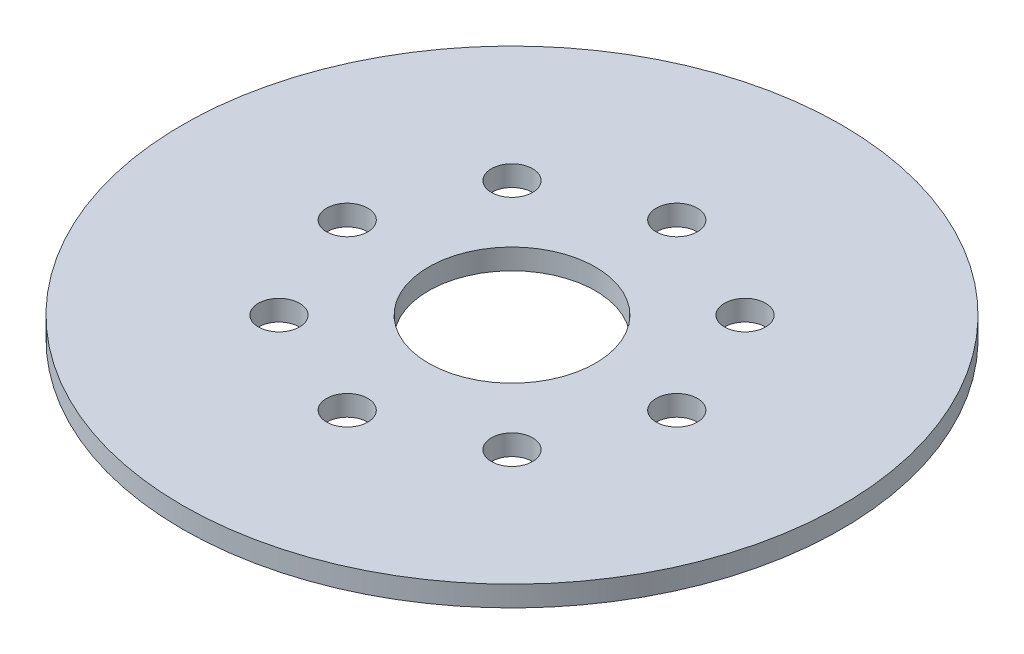
ISO-10303-21;
HEADER;
FILE_DESCRIPTION(('STEP AP214'),'2;1');
FILE_NAME('part.step','',(''),(''),'','','');
FILE_SCHEMA(('AUTOMOTIVE_DESIGN { 1 0 10303 214 1 1 1 1 }'));
ENDSEC;
DATA;
#1=APPLICATION_CONTEXT('core data for automotive mechanical design processes');
#2=APPLICATION_PROTOCOL_DEFINITION('international standard','automotive_design',2000,#1);
#3=PRODUCT_CONTEXT('',#1,'mechanical');
#4=PRODUCT('Part','Part','',(#3));
#5=PRODUCT_RELATED_PRODUCT_CATEGORY('part','',(#4));
#6=PRODUCT_DEFINITION_FORMATION('','',#4);
#7=PRODUCT_DEFINITION_CONTEXT('part definition',#1,'design');
#8=PRODUCT_DEFINITION('design','',#6,#7);
#9=PRODUCT_DEFINITION_SHAPE('','',#8);
#10=(LENGTH_UNIT() NAMED_UNIT(*) SI_UNIT(.MILLI.,.METRE.));
#11=(NAMED_UNIT(*) PLANE_ANGLE_UNIT() SI_UNIT($,.RADIAN.));
#12=(NAMED_UNIT(*) SI_UNIT($,.STERADIAN.) SOLID_ANGLE_UNIT());
#13=UNCERTAINTY_MEASURE_WITH_UNIT(LENGTH_MEASURE(1.E-05),#10,'distance_accuracy_value','');
#14=(GEOMETRIC_REPRESENTATION_CONTEXT(3) GLOBAL_UNCERTAINTY_ASSIGNED_CONTEXT((#13)) GLOBAL_UNIT_ASSIGNED_CONTEXT((#10,
#11,#12)) REPRESENTATION_CONTEXT('',''));
#15=CARTESIAN_POINT('',(0.,0.,0.));
#16=DIRECTION('',(0.,0.,1.));
#17=DIRECTION('',(1.,0.,0.));
#18=AXIS2_PLACEMENT_3D('',#15,#16,#17);
#19=CARTESIAN_POINT('',(0.,1.,0.));
#20=DIRECTION('',(0.,1.,0.));
#21=DIRECTION('',(0.,0.,1.));
#22=AXIS2_PLACEMENT_3D('',#19,#20,#21);
#23=PLANE('',#22);
#24=CARTESIAN_POINT('',(-8.,1.,0.));
#25=DIRECTION('',(0.,1.,0.));
#26=DIRECTION('',(0.,0.,1.));
#27=AXIS2_PLACEMENT_3D('',#24,#25,#26);
#28=CIRCLE('',#27,1.);
#29=CARTESIAN_POINT('',(-8.,1.,1.));
#30=VERTEX_POINT('',#29);
#31=EDGE_CURVE('E85',#30,#30,#28,.T.);
#32=ORIENTED_EDGE('',*,*,#31,.F.);
#33=EDGE_LOOP('',(#32));
#34=FACE_BOUND('',#33,.T.);
#35=CARTESIAN_POINT('',(0.,1.,8.));
#36=DIRECTION('',(0.,1.,0.));
#37=DIRECTION('',(0.,0.,1.));
#38=AXIS2_PLACEMENT_3D('',#35,#36,#37);
#39=CIRCLE('',#38,1.);
#40=CARTESIAN_POINT('',(0.,1.,9.));
#41=VERTEX_POINT('',#40);
#42=EDGE_CURVE('E73',#41,#41,#39,.T.);
#43=ORIENTED_EDGE('',*,*,#42,.F.);
#44=EDGE_LOOP('',(#43));
#45=FACE_BOUND('',#44,.T.);
#46=CARTESIAN_POINT('',(8.,1.,0.));
#47=DIRECTION('',(0.,1.,0.));
#48=DIRECTION('',(0.,0.,1.));
#49=AXIS2_PLACEMENT_3D('',#46,#47,#48);
#50=CIRCLE('',#49,1.);
#51=CARTESIAN_POINT('',(8.,1.,1.));
#52=VERTEX_POINT('',#51);
#53=EDGE_CURVE('E61',#52,#52,#50,.T.);
#54=ORIENTED_EDGE('',*,*,#53,.F.);
#55=EDGE_LOOP('',(#54));
#56=FACE_BOUND('',#55,.T.);
#57=CARTESIAN_POINT('',(0.,1.,-8.));
#58=DIRECTION('',(0.,1.,0.));
#59=DIRECTION('',(0.,0.,1.));
#60=AXIS2_PLACEMENT_3D('',#57,#58,#59);
#61=CIRCLE('',#60,1.);
#62=CARTESIAN_POINT('',(0.,1.,-7.));
#63=VERTEX_POINT('',#62);
#64=EDGE_CURVE('E49',#63,#63,#61,.T.);
#65=ORIENTED_EDGE('',*,*,#64,.F.);
#66=EDGE_LOOP('',(#65));
#67=FACE_BOUND('',#66,.T.);
#68=CARTESIAN_POINT('',(0.,1.,0.));
#69=DIRECTION('',(0.,1.,0.));
#70=DIRECTION('',(0.,0.,1.));
#71=AXIS2_PLACEMENT_3D('',#68,#69,#70);
#72=CIRCLE('',#71,16.);
#73=CARTESIAN_POINT('',(0.,1.,16.));
#74=VERTEX_POINT('',#73);
#75=EDGE_CURVE('E10',#74,#74,#72,.T.);
#76=ORIENTED_EDGE('',*,*,#75,.T.);
#77=EDGE_LOOP('',(#76));
#78=FACE_BOUND('',#77,.T.);
#79=CARTESIAN_POINT('',(0.,1.,0.));
#80=DIRECTION('',(0.,1.,0.));
#81=DIRECTION('',(0.,0.,1.));
#82=AXIS2_PLACEMENT_3D('',#79,#80,#81);
#83=CIRCLE('',#82,4.05);
#84=CARTESIAN_POINT('',(0.,1.,4.05));
#85=VERTEX_POINT('',#84);
#86=EDGE_CURVE('E44',#85,#85,#83,.T.);
#87=ORIENTED_EDGE('',*,*,#86,.F.);
#88=EDGE_LOOP('',(#87));
#89=FACE_BOUND('',#88,.T.);
#90=CARTESIAN_POINT('',(5.65685424949238,1.,-5.65685424949238));
#91=DIRECTION('',(0.,1.,0.));
#92=DIRECTION('',(0.,0.,1.));
#93=AXIS2_PLACEMENT_3D('',#90,#91,#92);
#94=CIRCLE('',#93,1.);
#95=CARTESIAN_POINT('',(5.65685424949238,1.,-4.65685424949238));
#96=VERTEX_POINT('',#95);
#97=EDGE_CURVE('E55',#96,#96,#94,.T.);
#98=ORIENTED_EDGE('',*,*,#97,.F.);
#99=EDGE_LOOP('',(#98));
#100=FACE_BOUND('',#99,.T.);
#101=CARTESIAN_POINT('',(5.65685424949238,1.,5.65685424949238));
#102=DIRECTION('',(0.,1.,0.));
#103=DIRECTION('',(0.,0.,1.));
#104=AXIS2_PLACEMENT_3D('',#101,#102,#103);
#105=CIRCLE('',#104,1.);
#106=CARTESIAN_POINT('',(5.65685424949238,1.,6.65685424949238));
#107=VERTEX_POINT('',#106);
#108=EDGE_CURVE('E67',#107,#107,#105,.T.);
#109=ORIENTED_EDGE('',*,*,#108,.F.);
#110=EDGE_LOOP('',(#109));
#111=FACE_BOUND('',#110,.T.);
#112=CARTESIAN_POINT('',(-5.65685424949238,1.,5.65685424949238));
#113=DIRECTION('',(0.,1.,0.));
#114=DIRECTION('',(0.,0.,1.));
#115=AXIS2_PLACEMENT_3D('',#112,#113,#114);
#116=CIRCLE('',#115,1.);
#117=CARTESIAN_POINT('',(-5.65685424949238,1.,6.65685424949238));
#118=VERTEX_POINT('',#117);
#119=EDGE_CURVE('E79',#118,#118,#116,.T.);
#120=ORIENTED_EDGE('',*,*,#119,.F.);
#121=EDGE_LOOP('',(#120));
#122=FACE_BOUND('',#121,.T.);
#123=CARTESIAN_POINT('',(-5.65685424949238,1.,-5.65685424949238));
#124=DIRECTION('',(0.,1.,0.));
#125=DIRECTION('',(0.,0.,1.));
#126=AXIS2_PLACEMENT_3D('',#123,#124,#125);
#127=CIRCLE('',#126,1.);
#128=CARTESIAN_POINT('',(-5.65685424949238,1.,-4.65685424949238));
#129=VERTEX_POINT('',#128);
#130=EDGE_CURVE('E91',#129,#129,#127,.T.);
#131=ORIENTED_EDGE('',*,*,#130,.F.);
#132=EDGE_LOOP('',(#131));
#133=FACE_BOUND('',#132,.T.);
#134=ADVANCED_FACE('F33',(#34,#45,#56,#67,#78,#89,#100,#111,#122,#133),#23,.T.);
#135=CARTESIAN_POINT('',(0.,0.,0.));
#136=DIRECTION('',(0.,1.,0.));
#137=DIRECTION('',(0.,0.,1.));
#138=AXIS2_PLACEMENT_3D('',#135,#136,#137);
#139=PLANE('',#138);
#140=CARTESIAN_POINT('',(0.,0.,0.));
#141=DIRECTION('',(0.,1.,0.));
#142=DIRECTION('',(0.,0.,1.));
#143=AXIS2_PLACEMENT_3D('',#140,#141,#142);
#144=CIRCLE('',#143,16.);
#145=CARTESIAN_POINT('',(0.,0.,16.));
#146=VERTEX_POINT('',#145);
#147=EDGE_CURVE('E37',#146,#146,#144,.T.);
#148=ORIENTED_EDGE('',*,*,#147,.F.);
#149=EDGE_LOOP('',(#148));
#150=FACE_BOUND('',#149,.T.);
#151=CARTESIAN_POINT('',(0.,0.,0.));
#152=DIRECTION('',(0.,1.,0.));
#153=DIRECTION('',(0.,0.,1.));
#154=AXIS2_PLACEMENT_3D('',#151,#152,#153);
#155=CIRCLE('',#154,4.05);
#156=CARTESIAN_POINT('',(0.,0.,4.05));
#157=VERTEX_POINT('',#156);
#158=EDGE_CURVE('E46',#157,#157,#155,.T.);
#159=ORIENTED_EDGE('',*,*,#158,.T.);
#160=EDGE_LOOP('',(#159));
#161=FACE_BOUND('',#160,.T.);
#162=CARTESIAN_POINT('',(0.,0.,-8.));
#163=DIRECTION('',(0.,1.,0.));
#164=DIRECTION('',(0.,0.,1.));
#165=AXIS2_PLACEMENT_3D('',#162,#163,#164);
#166=CIRCLE('',#165,1.);
#167=CARTESIAN_POINT('',(0.,0.,-7.));
#168=VERTEX_POINT('',#167);
#169=EDGE_CURVE('E52',#168,#168,#166,.T.);
#170=ORIENTED_EDGE('',*,*,#169,.T.);
#171=EDGE_LOOP('',(#170));
#172=FACE_BOUND('',#171,.T.);
#173=CARTESIAN_POINT('',(5.65685424949238,0.,-5.65685424949238));
#174=DIRECTION('',(0.,1.,0.));
#175=DIRECTION('',(0.,0.,1.));
#176=AXIS2_PLACEMENT_3D('',#173,#174,#175);
#177=CIRCLE('',#176,1.);
#178=CARTESIAN_POINT('',(5.65685424949238,0.,-4.65685424949238));
#179=VERTEX_POINT('',#178);
#180=EDGE_CURVE('E58',#179,#179,#177,.T.);
#181=ORIENTED_EDGE('',*,*,#180,.T.);
#182=EDGE_LOOP('',(#181));
#183=FACE_BOUND('',#182,.T.);
#184=CARTESIAN_POINT('',(8.,0.,0.));
#185=DIRECTION('',(0.,1.,0.));
#186=DIRECTION('',(0.,0.,1.));
#187=AXIS2_PLACEMENT_3D('',#184,#185,#186);
#188=CIRCLE('',#187,1.);
#189=CARTESIAN_POINT('',(8.,0.,1.));
#190=VERTEX_POINT('',#189);
#191=EDGE_CURVE('E64',#190,#190,#188,.T.);
#192=ORIENTED_EDGE('',*,*,#191,.T.);
#193=EDGE_LOOP('',(#192));
#194=FACE_BOUND('',#193,.T.);
#195=CARTESIAN_POINT('',(5.65685424949238,0.,5.65685424949238));
#196=DIRECTION('',(0.,1.,0.));
#197=DIRECTION('',(0.,0.,1.));
#198=AXIS2_PLACEMENT_3D('',#195,#196,#197);
#199=CIRCLE('',#198,1.);
#200=CARTESIAN_POINT('',(5.65685424949238,0.,6.65685424949238));
#201=VERTEX_POINT('',#200);
#202=EDGE_CURVE('E70',#201,#201,#199,.T.);
#203=ORIENTED_EDGE('',*,*,#202,.T.);
#204=EDGE_LOOP('',(#203));
#205=FACE_BOUND('',#204,.T.);
#206=CARTESIAN_POINT('',(0.,0.,8.));
#207=DIRECTION('',(0.,1.,0.));
#208=DIRECTION('',(0.,0.,1.));
#209=AXIS2_PLACEMENT_3D('',#206,#207,#208);
#210=CIRCLE('',#209,1.);
#211=CARTESIAN_POINT('',(0.,0.,9.));
#212=VERTEX_POINT('',#211);
#213=EDGE_CURVE('E76',#212,#212,#210,.T.);
#214=ORIENTED_EDGE('',*,*,#213,.T.);
#215=EDGE_LOOP('',(#214));
#216=FACE_BOUND('',#215,.T.);
#217=CARTESIAN_POINT('',(-5.65685424949238,0.,5.65685424949238));
#218=DIRECTION('',(0.,1.,0.));
#219=DIRECTION('',(0.,0.,1.));
#220=AXIS2_PLACEMENT_3D('',#217,#218,#219);
#221=CIRCLE('',#220,1.);
#222=CARTESIAN_POINT('',(-5.65685424949238,0.,6.65685424949238));
#223=VERTEX_POINT('',#222);
#224=EDGE_CURVE('E82',#223,#223,#221,.T.);
#225=ORIENTED_EDGE('',*,*,#224,.T.);
#226=EDGE_LOOP('',(#225));
#227=FACE_BOUND('',#226,.T.);
#228=CARTESIAN_POINT('',(-8.,0.,0.));
#229=DIRECTION('',(0.,1.,0.));
#230=DIRECTION('',(0.,0.,1.));
#231=AXIS2_PLACEMENT_3D('',#228,#229,#230);
#232=CIRCLE('',#231,1.);
#233=CARTESIAN_POINT('',(-8.,0.,1.));
#234=VERTEX_POINT('',#233);
#235=EDGE_CURVE('E88',#234,#234,#232,.T.);
#236=ORIENTED_EDGE('',*,*,#235,.T.);
#237=EDGE_LOOP('',(#236));
#238=FACE_BOUND('',#237,.T.);
#239=CARTESIAN_POINT('',(-5.65685424949238,0.,-5.65685424949238));
#240=DIRECTION('',(0.,1.,0.));
#241=DIRECTION('',(0.,0.,1.));
#242=AXIS2_PLACEMENT_3D('',#239,#240,#241);
#243=CIRCLE('',#242,1.);
#244=CARTESIAN_POINT('',(-5.65685424949238,0.,-4.65685424949238));
#245=VERTEX_POINT('',#244);
#246=EDGE_CURVE('E94',#245,#245,#243,.T.);
#247=ORIENTED_EDGE('',*,*,#246,.T.);
#248=EDGE_LOOP('',(#247));
#249=FACE_BOUND('',#248,.T.);
#250=ADVANCED_FACE('F104',(#150,#161,#172,#183,#194,#205,#216,#227,#238,#249),#139,.F.);
#251=CARTESIAN_POINT('',(0.,1.,0.));
#252=DIRECTION('',(0.,-1.,0.));
#253=DIRECTION('',(0.,0.,-1.));
#254=AXIS2_PLACEMENT_3D('',#251,#252,#253);
#255=CYLINDRICAL_SURFACE('',#254,16.);
#256=ORIENTED_EDGE('',*,*,#75,.F.);
#257=EDGE_LOOP('',(#256));
#258=FACE_BOUND('',#257,.T.);
#259=ORIENTED_EDGE('',*,*,#147,.T.);
#260=EDGE_LOOP('',(#259));
#261=FACE_BOUND('',#260,.T.);
#262=ADVANCED_FACE('F35',(#258,#261),#255,.T.);
#263=CARTESIAN_POINT('',(0.,1.,0.));
#264=DIRECTION('',(0.,-1.,0.));
#265=DIRECTION('',(0.,0.,-1.));
#266=AXIS2_PLACEMENT_3D('',#263,#264,#265);
#267=CYLINDRICAL_SURFACE('',#266,4.05);
#268=ORIENTED_EDGE('',*,*,#86,.T.);
#269=EDGE_LOOP('',(#268));
#270=FACE_BOUND('',#269,.T.);
#271=ORIENTED_EDGE('',*,*,#158,.F.);
#272=EDGE_LOOP('',(#271));
#273=FACE_BOUND('',#272,.T.);
#274=ADVANCED_FACE('F114',(#270,#273),#267,.F.);
#275=CARTESIAN_POINT('',(0.,1.,-8.));
#276=DIRECTION('',(0.,-1.,0.));
#277=DIRECTION('',(0.,0.,-1.));
#278=AXIS2_PLACEMENT_3D('',#275,#276,#277);
#279=CYLINDRICAL_SURFACE('',#278,1.);
#280=ORIENTED_EDGE('',*,*,#64,.T.);
#281=EDGE_LOOP('',(#280));
#282=FACE_BOUND('',#281,.T.);
#283=ORIENTED_EDGE('',*,*,#169,.F.);
#284=EDGE_LOOP('',(#283));
#285=FACE_BOUND('',#284,.T.);
#286=ADVANCED_FACE('F117',(#282,#285),#279,.F.);
#287=CARTESIAN_POINT('',(5.65685424949238,1.,-5.65685424949238));
#288=DIRECTION('',(0.,-1.,0.));
#289=DIRECTION('',(0.,0.,-1.));
#290=AXIS2_PLACEMENT_3D('',#287,#288,#289);
#291=CYLINDRICAL_SURFACE('',#290,1.);
#292=ORIENTED_EDGE('',*,*,#97,.T.);
#293=EDGE_LOOP('',(#292));
#294=FACE_BOUND('',#293,.T.);
#295=ORIENTED_EDGE('',*,*,#180,.F.);
#296=EDGE_LOOP('',(#295));
#297=FACE_BOUND('',#296,.T.);
#298=ADVANCED_FACE('F121',(#294,#297),#291,.F.);
#299=CARTESIAN_POINT('',(8.,1.,0.));
#300=DIRECTION('',(0.,-1.,0.));
#301=DIRECTION('',(0.,0.,-1.));
#302=AXIS2_PLACEMENT_3D('',#299,#300,#301);
#303=CYLINDRICAL_SURFACE('',#302,1.);
#304=ORIENTED_EDGE('',*,*,#53,.T.);
#305=EDGE_LOOP('',(#304));
#306=FACE_BOUND('',#305,.T.);
#307=ORIENTED_EDGE('',*,*,#191,.F.);
#308=EDGE_LOOP('',(#307));
#309=FACE_BOUND('',#308,.T.);
#310=ADVANCED_FACE('F125',(#306,#309),#303,.F.);
#311=CARTESIAN_POINT('',(5.65685424949238,1.,5.65685424949238));
#312=DIRECTION('',(0.,-1.,0.));
#313=DIRECTION('',(0.,0.,-1.));
#314=AXIS2_PLACEMENT_3D('',#311,#312,#313);
#315=CYLINDRICAL_SURFACE('',#314,1.);
#316=ORIENTED_EDGE('',*,*,#108,.T.);
#317=EDGE_LOOP('',(#316));
#318=FACE_BOUND('',#317,.T.);
#319=ORIENTED_EDGE('',*,*,#202,.F.);
#320=EDGE_LOOP('',(#319));
#321=FACE_BOUND('',#320,.T.);
#322=ADVANCED_FACE('F129',(#318,#321),#315,.F.);
#323=CARTESIAN_POINT('',(0.,1.,8.));
#324=DIRECTION('',(0.,-1.,0.));
#325=DIRECTION('',(0.,0.,-1.));
#326=AXIS2_PLACEMENT_3D('',#323,#324,#325);
#327=CYLINDRICAL_SURFACE('',#326,1.);
#328=ORIENTED_EDGE('',*,*,#42,.T.);
#329=EDGE_LOOP('',(#328));
#330=FACE_BOUND('',#329,.T.);
#331=ORIENTED_EDGE('',*,*,#213,.F.);
#332=EDGE_LOOP('',(#331));
#333=FACE_BOUND('',#332,.T.);
#334=ADVANCED_FACE('F133',(#330,#333),#327,.F.);
#335=CARTESIAN_POINT('',(-5.65685424949238,1.,5.65685424949238));
#336=DIRECTION('',(0.,-1.,0.));
#337=DIRECTION('',(0.,0.,-1.));
#338=AXIS2_PLACEMENT_3D('',#335,#336,#337);
#339=CYLINDRICAL_SURFACE('',#338,1.);
#340=ORIENTED_EDGE('',*,*,#119,.T.);
#341=EDGE_LOOP('',(#340));
#342=FACE_BOUND('',#341,.T.);
#343=ORIENTED_EDGE('',*,*,#224,.F.);
#344=EDGE_LOOP('',(#343));
#345=FACE_BOUND('',#344,.T.);
#346=ADVANCED_FACE('F137',(#342,#345),#339,.F.);
#347=CARTESIAN_POINT('',(-8.,1.,0.));
#348=DIRECTION('',(0.,-1.,0.));
#349=DIRECTION('',(0.,0.,-1.));
#350=AXIS2_PLACEMENT_3D('',#347,#348,#349);
#351=CYLINDRICAL_SURFACE('',#350,1.);
#352=ORIENTED_EDGE('',*,*,#31,.T.);
#353=EDGE_LOOP('',(#352));
#354=FACE_BOUND('',#353,.T.);
#355=ORIENTED_EDGE('',*,*,#235,.F.);
#356=EDGE_LOOP('',(#355));
#357=FACE_BOUND('',#356,.T.);
#358=ADVANCED_FACE('F141',(#354,#357),#351,.F.);
#359=CARTESIAN_POINT('',(-5.65685424949238,1.,-5.65685424949238));
#360=DIRECTION('',(0.,-1.,0.));
#361=DIRECTION('',(0.,0.,-1.));
#362=AXIS2_PLACEMENT_3D('',#359,#360,#361);
#363=CYLINDRICAL_SURFACE('',#362,1.);
#364=ORIENTED_EDGE('',*,*,#130,.T.);
#365=EDGE_LOOP('',(#364));
#366=FACE_BOUND('',#365,.T.);
#367=ORIENTED_EDGE('',*,*,#246,.F.);
#368=EDGE_LOOP('',(#367));
#369=FACE_BOUND('',#368,.T.);
#370=ADVANCED_FACE('F100',(#366,#369),#363,.F.);
#371=CLOSED_SHELL('',(#134,#250,#262,#274,#286,#298,#310,#322,#334,#346,#358,#370));
#372=MANIFOLD_SOLID_BREP('B2',#371);
#373=ADVANCED_BREP_SHAPE_REPRESENTATION('',(#18,#372),#14);
#374=SHAPE_DEFINITION_REPRESENTATION(#9,#373);
ENDSEC;
END-ISO-10303-21;
